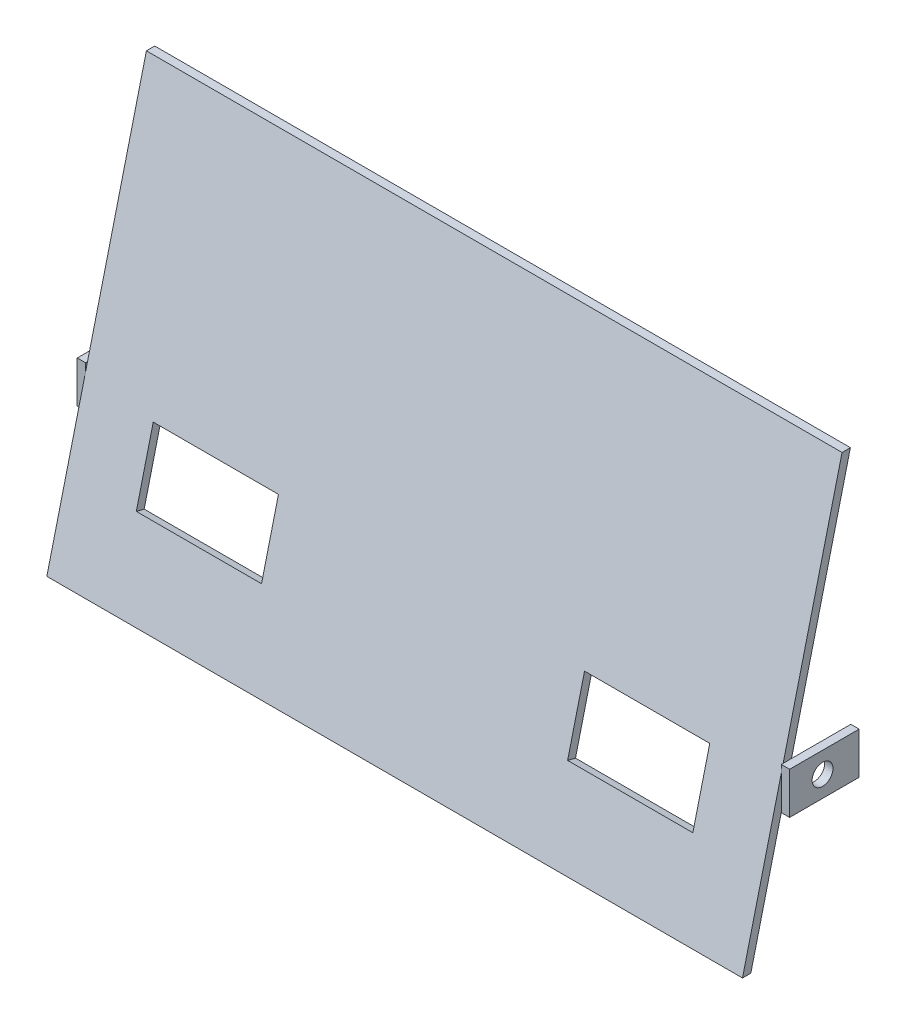
ISO-10303-21;
HEADER;
FILE_DESCRIPTION(('STEP AP214'),'2;1');
FILE_NAME('part.step','',(''),(''),'','','');
FILE_SCHEMA(('AUTOMOTIVE_DESIGN { 1 0 10303 214 1 1 1 1 }'));
ENDSEC;
DATA;
#1=APPLICATION_CONTEXT('core data for automotive mechanical design processes');
#2=APPLICATION_PROTOCOL_DEFINITION('international standard','automotive_design',2000,#1);
#3=PRODUCT_CONTEXT('',#1,'mechanical');
#4=PRODUCT('Part','Part','',(#3));
#5=PRODUCT_RELATED_PRODUCT_CATEGORY('part','',(#4));
#6=PRODUCT_DEFINITION_FORMATION('','',#4);
#7=PRODUCT_DEFINITION_CONTEXT('part definition',#1,'design');
#8=PRODUCT_DEFINITION('design','',#6,#7);
#9=PRODUCT_DEFINITION_SHAPE('','',#8);
#10=(LENGTH_UNIT() NAMED_UNIT(*) SI_UNIT(.MILLI.,.METRE.));
#11=(NAMED_UNIT(*) PLANE_ANGLE_UNIT() SI_UNIT($,.RADIAN.));
#12=(NAMED_UNIT(*) SI_UNIT($,.STERADIAN.) SOLID_ANGLE_UNIT());
#13=UNCERTAINTY_MEASURE_WITH_UNIT(LENGTH_MEASURE(1.E-05),#10,'distance_accuracy_value','');
#14=(GEOMETRIC_REPRESENTATION_CONTEXT(3) GLOBAL_UNCERTAINTY_ASSIGNED_CONTEXT((#13)) GLOBAL_UNIT_ASSIGNED_CONTEXT((#10,
#11,#12)) REPRESENTATION_CONTEXT('',''));
#15=CARTESIAN_POINT('',(0.,0.,0.));
#16=DIRECTION('',(0.,0.,1.));
#17=DIRECTION('',(1.,0.,0.));
#18=AXIS2_PLACEMENT_3D('',#15,#16,#17);
#19=CARTESIAN_POINT('',(-100.,0.,0.));
#20=DIRECTION('',(-1.,0.,0.));
#21=DIRECTION('',(0.,0.,1.));
#22=AXIS2_PLACEMENT_3D('',#19,#20,#21);
#23=PLANE('',#22);
#24=DIRECTION('',(0.,0.,-1.));
#25=VECTOR('',#24,1.);
#26=CARTESIAN_POINT('',(-100.,23.8,-15.5720993406739));
#27=LINE('',#26,#25);
#28=CARTESIAN_POINT('',(-100.,23.8,-5.84584069146286));
#29=VERTEX_POINT('',#28);
#30=CARTESIAN_POINT('',(-100.,23.8,-7.04584069146286));
#31=VERTEX_POINT('',#30);
#32=EDGE_CURVE('E307',#29,#31,#27,.T.);
#33=ORIENTED_EDGE('',*,*,#32,.F.);
#34=DIRECTION('',(0.,-0.971134279909636,0.238533457578581));
#35=VECTOR('',#34,1.);
#36=CARTESIAN_POINT('',(-100.,0.,0.));
#37=LINE('',#36,#35);
#38=CARTESIAN_POINT('',(-100.,58.2680567945782,-14.3120074547149));
#39=VERTEX_POINT('',#38);
#40=EDGE_CURVE('E370',#39,#29,#37,.T.);
#41=ORIENTED_EDGE('',*,*,#40,.F.);
#42=DIRECTION('',(0.,0.,1.));
#43=VECTOR('',#42,1.);
#44=CARTESIAN_POINT('',(-100.,58.2680567945782,-14.3120074547149));
#45=LINE('',#44,#43);
#46=CARTESIAN_POINT('',(-100.,58.2680567945782,-15.5120074547149));
#47=VERTEX_POINT('',#46);
#48=EDGE_CURVE('E385',#47,#39,#45,.T.);
#49=ORIENTED_EDGE('',*,*,#48,.F.);
#50=DIRECTION('',(0.,0.971134279909636,-0.238533457578581));
#51=VECTOR('',#50,1.);
#52=CARTESIAN_POINT('',(-100.,0.,-1.2));
#53=LINE('',#52,#51);
#54=EDGE_CURVE('E380',#31,#47,#53,.T.);
#55=ORIENTED_EDGE('',*,*,#54,.F.);
#56=EDGE_LOOP('',(#33,#41,#49,#55));
#57=FACE_BOUND('',#56,.T.);
#58=ADVANCED_FACE('F39',(#57),#23,.T.);
#59=CARTESIAN_POINT('',(0.,0.,0.));
#60=DIRECTION('',(-1.,0.,0.));
#61=DIRECTION('',(0.,0.,1.));
#62=AXIS2_PLACEMENT_3D('',#59,#60,#61);
#63=PLANE('',#62);
#64=DIRECTION('',(0.,-1.,0.));
#65=VECTOR('',#64,1.);
#66=CARTESIAN_POINT('',(0.,17.8,-5.57209934067391));
#67=LINE('',#66,#65);
#68=CARTESIAN_POINT('',(0.,22.6855248555966,-5.57209934067391));
#69=VERTEX_POINT('',#68);
#70=CARTESIAN_POINT('',(0.,17.8,-5.57209934067391));
#71=VERTEX_POINT('',#70);
#72=EDGE_CURVE('E343',#69,#71,#67,.T.);
#73=ORIENTED_EDGE('',*,*,#72,.F.);
#74=DIRECTION('',(0.,-0.971134279909636,0.238533457578581));
#75=VECTOR('',#74,1.);
#76=CARTESIAN_POINT('',(0.,0.,0.));
#77=LINE('',#76,#75);
#78=CARTESIAN_POINT('',(0.,0.,0.));
#79=VERTEX_POINT('',#78);
#80=EDGE_CURVE('E369',#69,#79,#77,.T.);
#81=ORIENTED_EDGE('',*,*,#80,.T.);
#82=DIRECTION('',(0.,0.,-1.));
#83=VECTOR('',#82,1.);
#84=CARTESIAN_POINT('',(0.,0.,0.));
#85=LINE('',#84,#83);
#86=CARTESIAN_POINT('',(0.,0.,-1.2));
#87=VERTEX_POINT('',#86);
#88=EDGE_CURVE('E394',#79,#87,#85,.T.);
#89=ORIENTED_EDGE('',*,*,#88,.T.);
#90=DIRECTION('',(0.,0.971134279909636,-0.238533457578581));
#91=VECTOR('',#90,1.);
#92=CARTESIAN_POINT('',(0.,0.,-1.2));
#93=LINE('',#92,#91);
#94=EDGE_CURVE('E400',#87,#71,#93,.T.);
#95=ORIENTED_EDGE('',*,*,#94,.T.);
#96=EDGE_LOOP('',(#73,#81,#89,#95));
#97=FACE_BOUND('',#96,.T.);
#98=ADVANCED_FACE('F464',(#97),#63,.F.);
#99=DIRECTION('',(0.,0.,1.));
#100=VECTOR('',#99,1.);
#101=CARTESIAN_POINT('',(0.,23.8,-5.57209934067391));
#102=LINE('',#101,#100);
#103=CARTESIAN_POINT('',(0.,23.8,-7.04584069146286));
#104=VERTEX_POINT('',#103);
#105=CARTESIAN_POINT('',(0.,23.8,-5.84584069146286));
#106=VERTEX_POINT('',#105);
#107=EDGE_CURVE('E353',#104,#106,#102,.T.);
#108=ORIENTED_EDGE('',*,*,#107,.F.);
#109=CARTESIAN_POINT('',(0.,58.2680567945782,-15.5120074547149));
#110=VERTEX_POINT('',#109);
#111=EDGE_CURVE('E399',#104,#110,#93,.T.);
#112=ORIENTED_EDGE('',*,*,#111,.T.);
#113=DIRECTION('',(0.,0.,1.));
#114=VECTOR('',#113,1.);
#115=CARTESIAN_POINT('',(0.,58.2680567945782,-14.3120074547149));
#116=LINE('',#115,#114);
#117=CARTESIAN_POINT('',(0.,58.2680567945782,-14.3120074547149));
#118=VERTEX_POINT('',#117);
#119=EDGE_CURVE('E404',#110,#118,#116,.T.);
#120=ORIENTED_EDGE('',*,*,#119,.T.);
#121=EDGE_CURVE('E391',#118,#106,#77,.T.);
#122=ORIENTED_EDGE('',*,*,#121,.T.);
#123=EDGE_LOOP('',(#108,#112,#120,#122));
#124=FACE_BOUND('',#123,.T.);
#125=ADVANCED_FACE('F473',(#124),#63,.F.);
#126=CARTESIAN_POINT('',(-100.,0.,0.));
#127=DIRECTION('',(0.,0.238533457578581,0.971134279909636));
#128=DIRECTION('',(0.,-0.971134279909636,0.238533457578581));
#129=AXIS2_PLACEMENT_3D('',#126,#127,#128);
#130=PLANE('',#129);
#131=DIRECTION('',(0.,-0.971134279909636,0.238533457578581));
#132=VECTOR('',#131,1.);
#133=CARTESIAN_POINT('',(-90.,21.5591810139939,-5.29544275824451));
#134=LINE('',#133,#132);
#135=CARTESIAN_POINT('',(-90.,21.5591810139939,-5.29544275824451));
#136=VERTEX_POINT('',#135);
#137=CARTESIAN_POINT('',(-90.,11.6536113589156,-2.86240149094298));
#138=VERTEX_POINT('',#137);
#139=EDGE_CURVE('E55',#136,#138,#134,.T.);
#140=ORIENTED_EDGE('',*,*,#139,.F.);
#141=DIRECTION('',(-1.,0.,0.));
#142=VECTOR('',#141,1.);
#143=CARTESIAN_POINT('',(-90.,21.5591810139939,-5.29544275824451));
#144=LINE('',#143,#142);
#145=CARTESIAN_POINT('',(-72.,21.5591810139939,-5.29544275824451));
#146=VERTEX_POINT('',#145);
#147=EDGE_CURVE('E219',#146,#136,#144,.T.);
#148=ORIENTED_EDGE('',*,*,#147,.F.);
#149=DIRECTION('',(0.,0.971134279909636,-0.238533457578582));
#150=VECTOR('',#149,1.);
#151=CARTESIAN_POINT('',(-72.,21.5591810139939,-5.29544275824451));
#152=LINE('',#151,#150);
#153=CARTESIAN_POINT('',(-72.,11.6536113589156,-2.86240149094298));
#154=VERTEX_POINT('',#153);
#155=EDGE_CURVE('E201',#154,#146,#152,.T.);
#156=ORIENTED_EDGE('',*,*,#155,.F.);
#157=DIRECTION('',(1.,0.,0.));
#158=VECTOR('',#157,1.);
#159=CARTESIAN_POINT('',(-90.,11.6536113589156,-2.86240149094298));
#160=LINE('',#159,#158);
#161=EDGE_CURVE('E212',#138,#154,#160,.T.);
#162=ORIENTED_EDGE('',*,*,#161,.F.);
#163=EDGE_LOOP('',(#140,#148,#156,#162));
#164=FACE_BOUND('',#163,.T.);
#165=DIRECTION('',(0.,0.971134279909636,-0.238533457578581));
#166=VECTOR('',#165,1.);
#167=CARTESIAN_POINT('',(-9.99999999999999,21.5591810139939,-5.29544275824451));
#168=LINE('',#167,#166);
#169=CARTESIAN_POINT('',(-9.99999999999999,11.6536113589156,-2.86240149094298));
#170=VERTEX_POINT('',#169);
#171=CARTESIAN_POINT('',(-9.99999999999999,21.5591810139939,-5.29544275824451));
#172=VERTEX_POINT('',#171);
#173=EDGE_CURVE('E63',#170,#172,#168,.T.);
#174=ORIENTED_EDGE('',*,*,#173,.F.);
#175=DIRECTION('',(1.,0.,0.));
#176=VECTOR('',#175,1.);
#177=CARTESIAN_POINT('',(-9.99999999999999,11.6536113589156,-2.86240149094298));
#178=LINE('',#177,#176);
#179=CARTESIAN_POINT('',(-28.,11.6536113589156,-2.86240149094298));
#180=VERTEX_POINT('',#179);
#181=EDGE_CURVE('E244',#180,#170,#178,.T.);
#182=ORIENTED_EDGE('',*,*,#181,.F.);
#183=DIRECTION('',(0.,-0.971134279909636,0.238533457578582));
#184=VECTOR('',#183,1.);
#185=CARTESIAN_POINT('',(-28.,21.5591810139939,-5.29544275824451));
#186=LINE('',#185,#184);
#187=CARTESIAN_POINT('',(-28.,21.5591810139939,-5.29544275824451));
#188=VERTEX_POINT('',#187);
#189=EDGE_CURVE('E240',#188,#180,#186,.T.);
#190=ORIENTED_EDGE('',*,*,#189,.F.);
#191=DIRECTION('',(-1.,0.,0.));
#192=VECTOR('',#191,1.);
#193=CARTESIAN_POINT('',(-9.99999999999999,21.5591810139939,-5.29544275824451));
#194=LINE('',#193,#192);
#195=EDGE_CURVE('E236',#172,#188,#194,.T.);
#196=ORIENTED_EDGE('',*,*,#195,.F.);
#197=EDGE_LOOP('',(#174,#182,#190,#196));
#198=FACE_BOUND('',#197,.T.);
#199=ORIENTED_EDGE('',*,*,#121,.F.);
#200=DIRECTION('',(1.,0.,0.));
#201=VECTOR('',#200,1.);
#202=CARTESIAN_POINT('',(-100.,58.2680567945782,-14.3120074547149));
#203=LINE('',#202,#201);
#204=EDGE_CURVE('E409',#39,#118,#203,.T.);
#205=ORIENTED_EDGE('',*,*,#204,.F.);
#206=ORIENTED_EDGE('',*,*,#40,.T.);
#207=CARTESIAN_POINT('',(-100.,22.6855248555966,-5.57209934067391));
#208=VERTEX_POINT('',#207);
#209=EDGE_CURVE('E375',#29,#208,#37,.T.);
#210=ORIENTED_EDGE('',*,*,#209,.T.);
#211=CARTESIAN_POINT('',(-100.,0.,0.));
#212=VERTEX_POINT('',#211);
#213=EDGE_CURVE('E376',#208,#212,#37,.T.);
#214=ORIENTED_EDGE('',*,*,#213,.T.);
#215=DIRECTION('',(1.,0.,0.));
#216=VECTOR('',#215,1.);
#217=CARTESIAN_POINT('',(-100.,0.,0.));
#218=LINE('',#217,#216);
#219=EDGE_CURVE('E390',#212,#79,#218,.T.);
#220=ORIENTED_EDGE('',*,*,#219,.T.);
#221=ORIENTED_EDGE('',*,*,#80,.F.);
#222=EDGE_CURVE('E395',#106,#69,#77,.T.);
#223=ORIENTED_EDGE('',*,*,#222,.F.);
#224=EDGE_LOOP('',(#199,#205,#206,#210,#214,#220,#221,#223));
#225=FACE_BOUND('',#224,.T.);
#226=ADVANCED_FACE('F41',(#164,#198,#225),#130,.T.);
#227=CARTESIAN_POINT('',(-100.,58.2680567945782,-14.3120074547149));
#228=DIRECTION('',(0.,1.,0.));
#229=DIRECTION('',(0.,0.,1.));
#230=AXIS2_PLACEMENT_3D('',#227,#228,#229);
#231=PLANE('',#230);
#232=ORIENTED_EDGE('',*,*,#119,.F.);
#233=DIRECTION('',(1.,0.,0.));
#234=VECTOR('',#233,1.);
#235=CARTESIAN_POINT('',(-100.,58.2680567945782,-15.5120074547149));
#236=LINE('',#235,#234);
#237=EDGE_CURVE('E412',#47,#110,#236,.T.);
#238=ORIENTED_EDGE('',*,*,#237,.F.);
#239=ORIENTED_EDGE('',*,*,#48,.T.);
#240=ORIENTED_EDGE('',*,*,#204,.T.);
#241=EDGE_LOOP('',(#232,#238,#239,#240));
#242=FACE_BOUND('',#241,.T.);
#243=ADVANCED_FACE('F558',(#242),#231,.T.);
#244=CARTESIAN_POINT('',(-100.,0.,-1.2));
#245=DIRECTION('',(0.,-0.238533457578581,-0.971134279909636));
#246=DIRECTION('',(0.,0.971134279909636,-0.238533457578581));
#247=AXIS2_PLACEMENT_3D('',#244,#245,#246);
#248=PLANE('',#247);
#249=DIRECTION('',(0.,0.971134279909636,-0.238533457578581));
#250=VECTOR('',#249,1.);
#251=CARTESIAN_POINT('',(-90.,0.,-1.2));
#252=LINE('',#251,#250);
#253=CARTESIAN_POINT('',(-90.,11.3756337378437,-3.9941236384817));
#254=VERTEX_POINT('',#253);
#255=CARTESIAN_POINT('',(-90.,21.281203392922,-6.42716490578323));
#256=VERTEX_POINT('',#255);
#257=EDGE_CURVE('E11',#254,#256,#252,.T.);
#258=ORIENTED_EDGE('',*,*,#257,.F.);
#259=DIRECTION('',(-1.,0.,0.));
#260=VECTOR('',#259,1.);
#261=CARTESIAN_POINT('',(-100.,11.3756337378437,-3.99412363848171));
#262=LINE('',#261,#260);
#263=CARTESIAN_POINT('',(-72.,11.3756337378437,-3.99412363848171));
#264=VERTEX_POINT('',#263);
#265=EDGE_CURVE('E435',#264,#254,#262,.T.);
#266=ORIENTED_EDGE('',*,*,#265,.F.);
#267=DIRECTION('',(0.,-0.971134279909636,0.238533457578581));
#268=VECTOR('',#267,1.);
#269=CARTESIAN_POINT('',(-72.,0.,-1.2));
#270=LINE('',#269,#268);
#271=CARTESIAN_POINT('',(-72.,21.281203392922,-6.42716490578324));
#272=VERTEX_POINT('',#271);
#273=EDGE_CURVE('E204',#272,#264,#270,.T.);
#274=ORIENTED_EDGE('',*,*,#273,.F.);
#275=DIRECTION('',(1.,0.,0.));
#276=VECTOR('',#275,1.);
#277=CARTESIAN_POINT('',(-100.,21.281203392922,-6.42716490578324));
#278=LINE('',#277,#276);
#279=EDGE_CURVE('E48',#256,#272,#278,.T.);
#280=ORIENTED_EDGE('',*,*,#279,.F.);
#281=EDGE_LOOP('',(#258,#266,#274,#280));
#282=FACE_BOUND('',#281,.T.);
#283=DIRECTION('',(0.,-0.971134279909636,0.238533457578581));
#284=VECTOR('',#283,1.);
#285=CARTESIAN_POINT('',(-9.99999999999999,0.,-1.2));
#286=LINE('',#285,#284);
#287=CARTESIAN_POINT('',(-9.99999999999999,21.281203392922,-6.42716490578323));
#288=VERTEX_POINT('',#287);
#289=CARTESIAN_POINT('',(-9.99999999999999,11.3756337378437,-3.9941236384817));
#290=VERTEX_POINT('',#289);
#291=EDGE_CURVE('E432',#288,#290,#286,.T.);
#292=ORIENTED_EDGE('',*,*,#291,.F.);
#293=DIRECTION('',(1.,0.,0.));
#294=VECTOR('',#293,1.);
#295=CARTESIAN_POINT('',(-100.,21.281203392922,-6.42716490578323));
#296=LINE('',#295,#294);
#297=CARTESIAN_POINT('',(-28.,21.281203392922,-6.42716490578323));
#298=VERTEX_POINT('',#297);
#299=EDGE_CURVE('E422',#298,#288,#296,.T.);
#300=ORIENTED_EDGE('',*,*,#299,.F.);
#301=DIRECTION('',(0.,0.971134279909636,-0.238533457578581));
#302=VECTOR('',#301,1.);
#303=CARTESIAN_POINT('',(-28.,0.,-1.2));
#304=LINE('',#303,#302);
#305=CARTESIAN_POINT('',(-28.,11.3756337378437,-3.99412363848171));
#306=VERTEX_POINT('',#305);
#307=EDGE_CURVE('E425',#306,#298,#304,.T.);
#308=ORIENTED_EDGE('',*,*,#307,.F.);
#309=DIRECTION('',(-1.,0.,0.));
#310=VECTOR('',#309,1.);
#311=CARTESIAN_POINT('',(-100.,11.3756337378437,-3.99412363848171));
#312=LINE('',#311,#310);
#313=EDGE_CURVE('E429',#290,#306,#312,.T.);
#314=ORIENTED_EDGE('',*,*,#313,.F.);
#315=EDGE_LOOP('',(#292,#300,#308,#314));
#316=FACE_BOUND('',#315,.T.);
#317=ORIENTED_EDGE('',*,*,#94,.F.);
#318=DIRECTION('',(1.,0.,0.));
#319=VECTOR('',#318,1.);
#320=CARTESIAN_POINT('',(-100.,0.,-1.2));
#321=LINE('',#320,#319);
#322=CARTESIAN_POINT('',(-100.,0.,-1.2));
#323=VERTEX_POINT('',#322);
#324=EDGE_CURVE('E416',#323,#87,#321,.T.);
#325=ORIENTED_EDGE('',*,*,#324,.F.);
#326=CARTESIAN_POINT('',(-100.,17.8,-5.57209934067391));
#327=VERTEX_POINT('',#326);
#328=EDGE_CURVE('E381',#323,#327,#53,.T.);
#329=ORIENTED_EDGE('',*,*,#328,.T.);
#330=EDGE_CURVE('E386',#327,#31,#53,.T.);
#331=ORIENTED_EDGE('',*,*,#330,.T.);
#332=ORIENTED_EDGE('',*,*,#54,.T.);
#333=ORIENTED_EDGE('',*,*,#237,.T.);
#334=ORIENTED_EDGE('',*,*,#111,.F.);
#335=EDGE_CURVE('E405',#71,#104,#93,.T.);
#336=ORIENTED_EDGE('',*,*,#335,.F.);
#337=EDGE_LOOP('',(#317,#325,#329,#331,#332,#333,#334,#336));
#338=FACE_BOUND('',#337,.T.);
#339=ADVANCED_FACE('F446',(#282,#316,#338),#248,.T.);
#340=CARTESIAN_POINT('',(-100.,0.,0.));
#341=DIRECTION('',(0.,-1.,0.));
#342=DIRECTION('',(0.,0.,-1.));
#343=AXIS2_PLACEMENT_3D('',#340,#341,#342);
#344=PLANE('',#343);
#345=ORIENTED_EDGE('',*,*,#88,.F.);
#346=ORIENTED_EDGE('',*,*,#219,.F.);
#347=DIRECTION('',(0.,0.,-1.));
#348=VECTOR('',#347,1.);
#349=CARTESIAN_POINT('',(-100.,0.,0.));
#350=LINE('',#349,#348);
#351=EDGE_CURVE('E374',#212,#323,#350,.T.);
#352=ORIENTED_EDGE('',*,*,#351,.T.);
#353=ORIENTED_EDGE('',*,*,#324,.T.);
#354=EDGE_LOOP('',(#345,#346,#352,#353));
#355=FACE_BOUND('',#354,.T.);
#356=ADVANCED_FACE('F478',(#355),#344,.T.);
#357=DIRECTION('',(0.,1.,0.));
#358=VECTOR('',#357,1.);
#359=CARTESIAN_POINT('',(-100.,17.8,-5.57209934067391));
#360=LINE('',#359,#358);
#361=EDGE_CURVE('E299',#327,#208,#360,.T.);
#362=ORIENTED_EDGE('',*,*,#361,.F.);
#363=ORIENTED_EDGE('',*,*,#328,.F.);
#364=ORIENTED_EDGE('',*,*,#351,.F.);
#365=ORIENTED_EDGE('',*,*,#213,.F.);
#366=EDGE_LOOP('',(#362,#363,#364,#365));
#367=FACE_BOUND('',#366,.T.);
#368=ADVANCED_FACE('F467',(#367),#23,.T.);
#369=CARTESIAN_POINT('',(0.,0.,0.));
#370=DIRECTION('',(-1.,0.,0.));
#371=DIRECTION('',(0.,0.,1.));
#372=AXIS2_PLACEMENT_3D('',#369,#370,#371);
#373=PLANE('',#372);
#374=CARTESIAN_POINT('',(0.,23.8,-5.57209934067391));
#375=VERTEX_POINT('',#374);
#376=EDGE_CURVE('E349',#106,#375,#102,.T.);
#377=ORIENTED_EDGE('',*,*,#376,.F.);
#378=ORIENTED_EDGE('',*,*,#222,.T.);
#379=EDGE_CURVE('E323',#375,#69,#67,.T.);
#380=ORIENTED_EDGE('',*,*,#379,.F.);
#381=EDGE_LOOP('',(#377,#378,#380));
#382=FACE_BOUND('',#381,.T.);
#383=ADVANCED_FACE('F477',(#382),#373,.T.);
#384=CARTESIAN_POINT('',(1.2,17.8,-5.57209934067391));
#385=DIRECTION('',(0.,0.,-1.));
#386=DIRECTION('',(-1.,0.,0.));
#387=AXIS2_PLACEMENT_3D('',#384,#385,#386);
#388=PLANE('',#387);
#389=ORIENTED_EDGE('',*,*,#379,.T.);
#390=ORIENTED_EDGE('',*,*,#72,.T.);
#391=DIRECTION('',(-1.,0.,0.));
#392=VECTOR('',#391,1.);
#393=CARTESIAN_POINT('',(1.2,17.8,-5.57209934067391));
#394=LINE('',#393,#392);
#395=CARTESIAN_POINT('',(1.2,17.8,-5.57209934067391));
#396=VERTEX_POINT('',#395);
#397=EDGE_CURVE('E365',#396,#71,#394,.T.);
#398=ORIENTED_EDGE('',*,*,#397,.F.);
#399=DIRECTION('',(0.,-1.,0.));
#400=VECTOR('',#399,1.);
#401=CARTESIAN_POINT('',(1.2,17.8,-5.57209934067391));
#402=LINE('',#401,#400);
#403=CARTESIAN_POINT('',(1.2,23.8,-5.57209934067391));
#404=VERTEX_POINT('',#403);
#405=EDGE_CURVE('E324',#404,#396,#402,.T.);
#406=ORIENTED_EDGE('',*,*,#405,.F.);
#407=DIRECTION('',(-1.,0.,0.));
#408=VECTOR('',#407,1.);
#409=CARTESIAN_POINT('',(1.2,23.8,-5.57209934067391));
#410=LINE('',#409,#408);
#411=EDGE_CURVE('E338',#404,#375,#410,.T.);
#412=ORIENTED_EDGE('',*,*,#411,.T.);
#413=EDGE_LOOP('',(#389,#390,#398,#406,#412));
#414=FACE_BOUND('',#413,.T.);
#415=ADVANCED_FACE('F484',(#414),#388,.F.);
#416=CARTESIAN_POINT('',(1.2,17.8,-5.57209934067391));
#417=DIRECTION('',(0.,1.,0.));
#418=DIRECTION('',(0.,0.,1.));
#419=AXIS2_PLACEMENT_3D('',#416,#417,#418);
#420=PLANE('',#419);
#421=DIRECTION('',(0.,0.,-1.));
#422=VECTOR('',#421,1.);
#423=CARTESIAN_POINT('',(0.,17.8,-5.57209934067391));
#424=LINE('',#423,#422);
#425=CARTESIAN_POINT('',(0.,17.8,-15.5720993406739));
#426=VERTEX_POINT('',#425);
#427=EDGE_CURVE('E342',#71,#426,#424,.T.);
#428=ORIENTED_EDGE('',*,*,#427,.T.);
#429=DIRECTION('',(-1.,0.,0.));
#430=VECTOR('',#429,1.);
#431=CARTESIAN_POINT('',(1.2,17.8,-15.5720993406739));
#432=LINE('',#431,#430);
#433=CARTESIAN_POINT('',(1.2,17.8,-15.5720993406739));
#434=VERTEX_POINT('',#433);
#435=EDGE_CURVE('E361',#434,#426,#432,.T.);
#436=ORIENTED_EDGE('',*,*,#435,.F.);
#437=DIRECTION('',(0.,0.,-1.));
#438=VECTOR('',#437,1.);
#439=CARTESIAN_POINT('',(1.2,17.8,-5.57209934067391));
#440=LINE('',#439,#438);
#441=EDGE_CURVE('E328',#396,#434,#440,.T.);
#442=ORIENTED_EDGE('',*,*,#441,.F.);
#443=ORIENTED_EDGE('',*,*,#397,.T.);
#444=EDGE_LOOP('',(#428,#436,#442,#443));
#445=FACE_BOUND('',#444,.T.);
#446=ADVANCED_FACE('F595',(#445),#420,.F.);
#447=CARTESIAN_POINT('',(1.2,17.8,-15.5720993406739));
#448=DIRECTION('',(0.,0.,1.));
#449=DIRECTION('',(0.,-1.,0.));
#450=AXIS2_PLACEMENT_3D('',#447,#448,#449);
#451=PLANE('',#450);
#452=DIRECTION('',(0.,1.,0.));
#453=VECTOR('',#452,1.);
#454=CARTESIAN_POINT('',(0.,17.8,-15.5720993406739));
#455=LINE('',#454,#453);
#456=CARTESIAN_POINT('',(0.,23.8,-15.5720993406739));
#457=VERTEX_POINT('',#456);
#458=EDGE_CURVE('E346',#426,#457,#455,.T.);
#459=ORIENTED_EDGE('',*,*,#458,.T.);
#460=DIRECTION('',(-1.,0.,0.));
#461=VECTOR('',#460,1.);
#462=CARTESIAN_POINT('',(1.2,23.8,-15.5720993406739));
#463=LINE('',#462,#461);
#464=CARTESIAN_POINT('',(1.2,23.8,-15.5720993406739));
#465=VERTEX_POINT('',#464);
#466=EDGE_CURVE('E357',#465,#457,#463,.T.);
#467=ORIENTED_EDGE('',*,*,#466,.F.);
#468=DIRECTION('',(0.,1.,0.));
#469=VECTOR('',#468,1.);
#470=CARTESIAN_POINT('',(1.2,17.8,-15.5720993406739));
#471=LINE('',#470,#469);
#472=EDGE_CURVE('E332',#434,#465,#471,.T.);
#473=ORIENTED_EDGE('',*,*,#472,.F.);
#474=ORIENTED_EDGE('',*,*,#435,.T.);
#475=EDGE_LOOP('',(#459,#467,#473,#474));
#476=FACE_BOUND('',#475,.T.);
#477=ADVANCED_FACE('F592',(#476),#451,.F.);
#478=CARTESIAN_POINT('',(1.2,23.8,-5.57209934067391));
#479=DIRECTION('',(0.,-1.,0.));
#480=DIRECTION('',(0.,0.,-1.));
#481=AXIS2_PLACEMENT_3D('',#478,#479,#480);
#482=PLANE('',#481);
#483=EDGE_CURVE('E329',#457,#104,#102,.T.);
#484=ORIENTED_EDGE('',*,*,#483,.T.);
#485=ORIENTED_EDGE('',*,*,#107,.T.);
#486=ORIENTED_EDGE('',*,*,#376,.T.);
#487=ORIENTED_EDGE('',*,*,#411,.F.);
#488=DIRECTION('',(0.,0.,1.));
#489=VECTOR('',#488,1.);
#490=CARTESIAN_POINT('',(1.2,23.8,-5.57209934067391));
#491=LINE('',#490,#489);
#492=EDGE_CURVE('E335',#465,#404,#491,.T.);
#493=ORIENTED_EDGE('',*,*,#492,.F.);
#494=ORIENTED_EDGE('',*,*,#466,.T.);
#495=EDGE_LOOP('',(#484,#485,#486,#487,#493,#494));
#496=FACE_BOUND('',#495,.T.);
#497=ADVANCED_FACE('F534',(#496),#482,.F.);
#498=CARTESIAN_POINT('',(1.2,0.,0.));
#499=DIRECTION('',(-1.,0.,0.));
#500=DIRECTION('',(0.,0.,1.));
#501=AXIS2_PLACEMENT_3D('',#498,#499,#500);
#502=PLANE('',#501);
#503=CARTESIAN_POINT('',(1.2,20.8,-10.3089700160684));
#504=DIRECTION('',(1.,0.,0.));
#505=DIRECTION('',(0.,0.,-1.));
#506=AXIS2_PLACEMENT_3D('',#503,#504,#505);
#507=CIRCLE('',#506,1.5);
#508=CARTESIAN_POINT('',(1.2,20.8,-11.8089700160684));
#509=VERTEX_POINT('',#508);
#510=EDGE_CURVE('E229',#509,#509,#507,.T.);
#511=ORIENTED_EDGE('',*,*,#510,.F.);
#512=EDGE_LOOP('',(#511));
#513=FACE_BOUND('',#512,.T.);
#514=ORIENTED_EDGE('',*,*,#405,.T.);
#515=ORIENTED_EDGE('',*,*,#441,.T.);
#516=ORIENTED_EDGE('',*,*,#472,.T.);
#517=ORIENTED_EDGE('',*,*,#492,.T.);
#518=EDGE_LOOP('',(#514,#515,#516,#517));
#519=FACE_BOUND('',#518,.T.);
#520=ADVANCED_FACE('F574',(#513,#519),#502,.F.);
#521=CARTESIAN_POINT('',(0.,20.8,-10.3089700160684));
#522=DIRECTION('',(-1.,0.,0.));
#523=DIRECTION('',(0.,0.,1.));
#524=AXIS2_PLACEMENT_3D('',#521,#522,#523);
#525=CIRCLE('',#524,1.5);
#526=CARTESIAN_POINT('',(0.,20.8,-8.80897001606839));
#527=VERTEX_POINT('',#526);
#528=EDGE_CURVE('E271',#527,#527,#525,.T.);
#529=ORIENTED_EDGE('',*,*,#528,.F.);
#530=EDGE_LOOP('',(#529));
#531=FACE_BOUND('',#530,.T.);
#532=ORIENTED_EDGE('',*,*,#427,.F.);
#533=ORIENTED_EDGE('',*,*,#335,.T.);
#534=ORIENTED_EDGE('',*,*,#483,.F.);
#535=ORIENTED_EDGE('',*,*,#458,.F.);
#536=EDGE_LOOP('',(#532,#533,#534,#535));
#537=FACE_BOUND('',#536,.T.);
#538=ADVANCED_FACE('F487',(#531,#537),#373,.T.);
#539=CARTESIAN_POINT('',(-100.,0.,0.));
#540=DIRECTION('',(1.,0.,0.));
#541=DIRECTION('',(0.,0.,-1.));
#542=AXIS2_PLACEMENT_3D('',#539,#540,#541);
#543=PLANE('',#542);
#544=ORIENTED_EDGE('',*,*,#209,.F.);
#545=CARTESIAN_POINT('',(-100.,23.8,-5.57209934067391));
#546=VERTEX_POINT('',#545);
#547=EDGE_CURVE('E281',#546,#29,#27,.T.);
#548=ORIENTED_EDGE('',*,*,#547,.F.);
#549=EDGE_CURVE('E298',#208,#546,#360,.T.);
#550=ORIENTED_EDGE('',*,*,#549,.F.);
#551=EDGE_LOOP('',(#544,#548,#550));
#552=FACE_BOUND('',#551,.T.);
#553=ADVANCED_FACE('F566',(#552),#543,.T.);
#554=CARTESIAN_POINT('',(-100.,20.8,-10.3089700160684));
#555=DIRECTION('',(1.,0.,0.));
#556=DIRECTION('',(0.,0.,-1.));
#557=AXIS2_PLACEMENT_3D('',#554,#555,#556);
#558=CIRCLE('',#557,1.5);
#559=CARTESIAN_POINT('',(-100.,20.8,-11.8089700160684));
#560=VERTEX_POINT('',#559);
#561=EDGE_CURVE('E264',#560,#560,#558,.T.);
#562=ORIENTED_EDGE('',*,*,#561,.F.);
#563=EDGE_LOOP('',(#562));
#564=FACE_BOUND('',#563,.T.);
#565=ORIENTED_EDGE('',*,*,#330,.F.);
#566=DIRECTION('',(0.,0.,1.));
#567=VECTOR('',#566,1.);
#568=CARTESIAN_POINT('',(-100.,17.8,-15.5720993406739));
#569=LINE('',#568,#567);
#570=CARTESIAN_POINT('',(-100.,17.8,-15.5720993406739));
#571=VERTEX_POINT('',#570);
#572=EDGE_CURVE('E294',#571,#327,#569,.T.);
#573=ORIENTED_EDGE('',*,*,#572,.F.);
#574=DIRECTION('',(0.,-1.,0.));
#575=VECTOR('',#574,1.);
#576=CARTESIAN_POINT('',(-100.,17.8,-15.5720993406739));
#577=LINE('',#576,#575);
#578=CARTESIAN_POINT('',(-100.,23.8,-15.5720993406739));
#579=VERTEX_POINT('',#578);
#580=EDGE_CURVE('E275',#579,#571,#577,.T.);
#581=ORIENTED_EDGE('',*,*,#580,.F.);
#582=EDGE_CURVE('E303',#31,#579,#27,.T.);
#583=ORIENTED_EDGE('',*,*,#582,.F.);
#584=EDGE_LOOP('',(#565,#573,#581,#583));
#585=FACE_BOUND('',#584,.T.);
#586=ADVANCED_FACE('F501',(#564,#585),#543,.T.);
#587=CARTESIAN_POINT('',(-101.2,17.8,-15.5720993406739));
#588=DIRECTION('',(0.,0.,1.));
#589=DIRECTION('',(1.,0.,0.));
#590=AXIS2_PLACEMENT_3D('',#587,#588,#589);
#591=PLANE('',#590);
#592=ORIENTED_EDGE('',*,*,#580,.T.);
#593=DIRECTION('',(1.,0.,0.));
#594=VECTOR('',#593,1.);
#595=CARTESIAN_POINT('',(-101.2,17.8,-15.5720993406739));
#596=LINE('',#595,#594);
#597=CARTESIAN_POINT('',(-101.2,17.8,-15.5720993406739));
#598=VERTEX_POINT('',#597);
#599=EDGE_CURVE('E319',#598,#571,#596,.T.);
#600=ORIENTED_EDGE('',*,*,#599,.F.);
#601=DIRECTION('',(0.,-1.,0.));
#602=VECTOR('',#601,1.);
#603=CARTESIAN_POINT('',(-101.2,17.8,-15.5720993406739));
#604=LINE('',#603,#602);
#605=CARTESIAN_POINT('',(-101.2,23.8,-15.5720993406739));
#606=VERTEX_POINT('',#605);
#607=EDGE_CURVE('E276',#606,#598,#604,.T.);
#608=ORIENTED_EDGE('',*,*,#607,.F.);
#609=DIRECTION('',(1.,0.,0.));
#610=VECTOR('',#609,1.);
#611=CARTESIAN_POINT('',(-101.2,23.8,-15.5720993406739));
#612=LINE('',#611,#610);
#613=EDGE_CURVE('E290',#606,#579,#612,.T.);
#614=ORIENTED_EDGE('',*,*,#613,.T.);
#615=EDGE_LOOP('',(#592,#600,#608,#614));
#616=FACE_BOUND('',#615,.T.);
#617=ADVANCED_FACE('F518',(#616),#591,.F.);
#618=CARTESIAN_POINT('',(-101.2,17.8,-15.5720993406739));
#619=DIRECTION('',(0.,1.,0.));
#620=DIRECTION('',(0.,0.,1.));
#621=AXIS2_PLACEMENT_3D('',#618,#619,#620);
#622=PLANE('',#621);
#623=ORIENTED_EDGE('',*,*,#572,.T.);
#624=DIRECTION('',(1.,0.,0.));
#625=VECTOR('',#624,1.);
#626=CARTESIAN_POINT('',(-101.2,17.8,-5.57209934067391));
#627=LINE('',#626,#625);
#628=CARTESIAN_POINT('',(-101.2,17.8,-5.57209934067391));
#629=VERTEX_POINT('',#628);
#630=EDGE_CURVE('E315',#629,#327,#627,.T.);
#631=ORIENTED_EDGE('',*,*,#630,.F.);
#632=DIRECTION('',(0.,0.,1.));
#633=VECTOR('',#632,1.);
#634=CARTESIAN_POINT('',(-101.2,17.8,-15.5720993406739));
#635=LINE('',#634,#633);
#636=EDGE_CURVE('E280',#598,#629,#635,.T.);
#637=ORIENTED_EDGE('',*,*,#636,.F.);
#638=ORIENTED_EDGE('',*,*,#599,.T.);
#639=EDGE_LOOP('',(#623,#631,#637,#638));
#640=FACE_BOUND('',#639,.T.);
#641=ADVANCED_FACE('F507',(#640),#622,.F.);
#642=CARTESIAN_POINT('',(-101.2,17.8,-5.57209934067391));
#643=DIRECTION('',(0.,0.,-1.));
#644=DIRECTION('',(-1.,0.,0.));
#645=AXIS2_PLACEMENT_3D('',#642,#643,#644);
#646=PLANE('',#645);
#647=ORIENTED_EDGE('',*,*,#361,.T.);
#648=ORIENTED_EDGE('',*,*,#549,.T.);
#649=DIRECTION('',(1.,0.,0.));
#650=VECTOR('',#649,1.);
#651=CARTESIAN_POINT('',(-101.2,23.8,-5.57209934067391));
#652=LINE('',#651,#650);
#653=CARTESIAN_POINT('',(-101.2,23.8,-5.57209934067391));
#654=VERTEX_POINT('',#653);
#655=EDGE_CURVE('E311',#654,#546,#652,.T.);
#656=ORIENTED_EDGE('',*,*,#655,.F.);
#657=DIRECTION('',(0.,1.,0.));
#658=VECTOR('',#657,1.);
#659=CARTESIAN_POINT('',(-101.2,17.8,-5.57209934067391));
#660=LINE('',#659,#658);
#661=EDGE_CURVE('E284',#629,#654,#660,.T.);
#662=ORIENTED_EDGE('',*,*,#661,.F.);
#663=ORIENTED_EDGE('',*,*,#630,.T.);
#664=EDGE_LOOP('',(#647,#648,#656,#662,#663));
#665=FACE_BOUND('',#664,.T.);
#666=ADVANCED_FACE('F510',(#665),#646,.F.);
#667=CARTESIAN_POINT('',(-101.2,23.8,-15.5720993406739));
#668=DIRECTION('',(0.,-1.,0.));
#669=DIRECTION('',(0.,0.,-1.));
#670=AXIS2_PLACEMENT_3D('',#667,#668,#669);
#671=PLANE('',#670);
#672=ORIENTED_EDGE('',*,*,#547,.T.);
#673=ORIENTED_EDGE('',*,*,#32,.T.);
#674=ORIENTED_EDGE('',*,*,#582,.T.);
#675=ORIENTED_EDGE('',*,*,#613,.F.);
#676=DIRECTION('',(0.,0.,-1.));
#677=VECTOR('',#676,1.);
#678=CARTESIAN_POINT('',(-101.2,23.8,-15.5720993406739));
#679=LINE('',#678,#677);
#680=EDGE_CURVE('E287',#654,#606,#679,.T.);
#681=ORIENTED_EDGE('',*,*,#680,.F.);
#682=ORIENTED_EDGE('',*,*,#655,.T.);
#683=EDGE_LOOP('',(#672,#673,#674,#675,#681,#682));
#684=FACE_BOUND('',#683,.T.);
#685=ADVANCED_FACE('F520',(#684),#671,.F.);
#686=CARTESIAN_POINT('',(-101.2,0.,0.));
#687=DIRECTION('',(1.,0.,0.));
#688=DIRECTION('',(0.,0.,-1.));
#689=AXIS2_PLACEMENT_3D('',#686,#687,#688);
#690=PLANE('',#689);
#691=CARTESIAN_POINT('',(-101.2,20.8,-10.3089700160684));
#692=DIRECTION('',(1.,0.,0.));
#693=DIRECTION('',(0.,0.,-1.));
#694=AXIS2_PLACEMENT_3D('',#691,#692,#693);
#695=CIRCLE('',#694,1.5);
#696=CARTESIAN_POINT('',(-101.2,20.8,-11.8089700160684));
#697=VERTEX_POINT('',#696);
#698=EDGE_CURVE('E260',#697,#697,#695,.T.);
#699=ORIENTED_EDGE('',*,*,#698,.T.);
#700=EDGE_LOOP('',(#699));
#701=FACE_BOUND('',#700,.T.);
#702=ORIENTED_EDGE('',*,*,#607,.T.);
#703=ORIENTED_EDGE('',*,*,#636,.T.);
#704=ORIENTED_EDGE('',*,*,#661,.T.);
#705=ORIENTED_EDGE('',*,*,#680,.T.);
#706=EDGE_LOOP('',(#702,#703,#704,#705));
#707=FACE_BOUND('',#706,.T.);
#708=ADVANCED_FACE('F514',(#701,#707),#690,.F.);
#709=CARTESIAN_POINT('',(-101.2,20.8,-10.3089700160684));
#710=DIRECTION('',(1.,0.,0.));
#711=DIRECTION('',(0.,0.,-1.));
#712=AXIS2_PLACEMENT_3D('',#709,#710,#711);
#713=CYLINDRICAL_SURFACE('',#712,1.5);
#714=ORIENTED_EDGE('',*,*,#561,.T.);
#715=EDGE_LOOP('',(#714));
#716=FACE_BOUND('',#715,.T.);
#717=ORIENTED_EDGE('',*,*,#698,.F.);
#718=EDGE_LOOP('',(#717));
#719=FACE_BOUND('',#718,.T.);
#720=ADVANCED_FACE('F642',(#716,#719),#713,.F.);
#721=ORIENTED_EDGE('',*,*,#528,.T.);
#722=EDGE_LOOP('',(#721));
#723=FACE_BOUND('',#722,.T.);
#724=ORIENTED_EDGE('',*,*,#510,.T.);
#725=EDGE_LOOP('',(#724));
#726=FACE_BOUND('',#725,.T.);
#727=ADVANCED_FACE('F652',(#723,#726),#713,.F.);
#728=CARTESIAN_POINT('',(-9.99999999999999,18.2197126078938,-18.8913226769794));
#729=DIRECTION('',(1.,0.,0.));
#730=DIRECTION('',(0.,0.,-1.));
#731=AXIS2_PLACEMENT_3D('',#728,#729,#730);
#732=PLANE('',#731);
#733=ORIENTED_EDGE('',*,*,#291,.T.);
#734=DIRECTION('',(0.,0.238533457578581,0.971134279909636));
#735=VECTOR('',#734,1.);
#736=CARTESIAN_POINT('',(-9.99999999999999,8.31414295281549,-16.4582814096779));
#737=LINE('',#736,#735);
#738=EDGE_CURVE('E249',#290,#170,#737,.T.);
#739=ORIENTED_EDGE('',*,*,#738,.T.);
#740=ORIENTED_EDGE('',*,*,#173,.T.);
#741=DIRECTION('',(0.,0.238533457578581,0.971134279909636));
#742=VECTOR('',#741,1.);
#743=CARTESIAN_POINT('',(-9.99999999999999,18.2197126078938,-18.8913226769794));
#744=LINE('',#743,#742);
#745=EDGE_CURVE('E248',#288,#172,#744,.T.);
#746=ORIENTED_EDGE('',*,*,#745,.F.);
#747=EDGE_LOOP('',(#733,#739,#740,#746));
#748=FACE_BOUND('',#747,.T.);
#749=ADVANCED_FACE('F661',(#748),#732,.F.);
#750=CARTESIAN_POINT('',(-9.99999999999999,8.31414295281549,-16.4582814096779));
#751=DIRECTION('',(0.,-0.971134279909636,0.238533457578581));
#752=DIRECTION('',(0.,-0.238533457578581,-0.971134279909636));
#753=AXIS2_PLACEMENT_3D('',#750,#751,#752);
#754=PLANE('',#753);
#755=ORIENTED_EDGE('',*,*,#313,.T.);
#756=DIRECTION('',(0.,0.238533457578581,0.971134279909636));
#757=VECTOR('',#756,1.);
#758=CARTESIAN_POINT('',(-28.,8.31414295281549,-16.4582814096779));
#759=LINE('',#758,#757);
#760=EDGE_CURVE('E252',#306,#180,#759,.T.);
#761=ORIENTED_EDGE('',*,*,#760,.T.);
#762=ORIENTED_EDGE('',*,*,#181,.T.);
#763=ORIENTED_EDGE('',*,*,#738,.F.);
#764=EDGE_LOOP('',(#755,#761,#762,#763));
#765=FACE_BOUND('',#764,.T.);
#766=ADVANCED_FACE('F682',(#765),#754,.F.);
#767=CARTESIAN_POINT('',(-28.,18.2197126078938,-18.8913226769794));
#768=DIRECTION('',(-1.,0.,0.));
#769=DIRECTION('',(0.,0.,1.));
#770=AXIS2_PLACEMENT_3D('',#767,#768,#769);
#771=PLANE('',#770);
#772=ORIENTED_EDGE('',*,*,#307,.T.);
#773=DIRECTION('',(0.,0.238533457578581,0.971134279909636));
#774=VECTOR('',#773,1.);
#775=CARTESIAN_POINT('',(-28.,18.2197126078938,-18.8913226769794));
#776=LINE('',#775,#774);
#777=EDGE_CURVE('E255',#298,#188,#776,.T.);
#778=ORIENTED_EDGE('',*,*,#777,.T.);
#779=ORIENTED_EDGE('',*,*,#189,.T.);
#780=ORIENTED_EDGE('',*,*,#760,.F.);
#781=EDGE_LOOP('',(#772,#778,#779,#780));
#782=FACE_BOUND('',#781,.T.);
#783=ADVANCED_FACE('F458',(#782),#771,.F.);
#784=CARTESIAN_POINT('',(-9.99999999999999,18.2197126078938,-18.8913226769794));
#785=DIRECTION('',(0.,0.971134279909636,-0.238533457578581));
#786=DIRECTION('',(0.,0.238533457578581,0.971134279909636));
#787=AXIS2_PLACEMENT_3D('',#784,#785,#786);
#788=PLANE('',#787);
#789=ORIENTED_EDGE('',*,*,#299,.T.);
#790=ORIENTED_EDGE('',*,*,#745,.T.);
#791=ORIENTED_EDGE('',*,*,#195,.T.);
#792=ORIENTED_EDGE('',*,*,#777,.F.);
#793=EDGE_LOOP('',(#789,#790,#791,#792));
#794=FACE_BOUND('',#793,.T.);
#795=ADVANCED_FACE('F451',(#794),#788,.F.);
#796=CARTESIAN_POINT('',(-90.,18.2197126078938,-18.8913226769794));
#797=DIRECTION('',(-1.,0.,0.));
#798=DIRECTION('',(0.,0.,1.));
#799=AXIS2_PLACEMENT_3D('',#796,#797,#798);
#800=PLANE('',#799);
#801=ORIENTED_EDGE('',*,*,#257,.T.);
#802=DIRECTION('',(0.,0.238533457578581,0.971134279909636));
#803=VECTOR('',#802,1.);
#804=CARTESIAN_POINT('',(-90.,18.2197126078938,-18.8913226769794));
#805=LINE('',#804,#803);
#806=EDGE_CURVE('E226',#256,#136,#805,.T.);
#807=ORIENTED_EDGE('',*,*,#806,.T.);
#808=ORIENTED_EDGE('',*,*,#139,.T.);
#809=DIRECTION('',(0.,0.238533457578581,0.971134279909636));
#810=VECTOR('',#809,1.);
#811=CARTESIAN_POINT('',(-90.,8.31414295281549,-16.4582814096779));
#812=LINE('',#811,#810);
#813=EDGE_CURVE('E209',#254,#138,#812,.T.);
#814=ORIENTED_EDGE('',*,*,#813,.F.);
#815=EDGE_LOOP('',(#801,#807,#808,#814));
#816=FACE_BOUND('',#815,.T.);
#817=ADVANCED_FACE('F448',(#816),#800,.F.);
#818=CARTESIAN_POINT('',(-90.,18.2197126078938,-18.8913226769794));
#819=DIRECTION('',(0.,0.971134279909636,-0.238533457578581));
#820=DIRECTION('',(0.,0.238533457578581,0.971134279909636));
#821=AXIS2_PLACEMENT_3D('',#818,#819,#820);
#822=PLANE('',#821);
#823=ORIENTED_EDGE('',*,*,#279,.T.);
#824=DIRECTION('',(0.,0.238533457578581,0.971134279909636));
#825=VECTOR('',#824,1.);
#826=CARTESIAN_POINT('',(-72.,18.2197126078938,-18.8913226769794));
#827=LINE('',#826,#825);
#828=EDGE_CURVE('E208',#272,#146,#827,.T.);
#829=ORIENTED_EDGE('',*,*,#828,.T.);
#830=ORIENTED_EDGE('',*,*,#147,.T.);
#831=ORIENTED_EDGE('',*,*,#806,.F.);
#832=EDGE_LOOP('',(#823,#829,#830,#831));
#833=FACE_BOUND('',#832,.T.);
#834=ADVANCED_FACE('F443',(#833),#822,.F.);
#835=CARTESIAN_POINT('',(-72.,18.2197126078938,-18.8913226769794));
#836=DIRECTION('',(1.,0.,0.));
#837=DIRECTION('',(0.,0.,-1.));
#838=AXIS2_PLACEMENT_3D('',#835,#836,#837);
#839=PLANE('',#838);
#840=ORIENTED_EDGE('',*,*,#273,.T.);
#841=DIRECTION('',(0.,0.238533457578581,0.971134279909636));
#842=VECTOR('',#841,1.);
#843=CARTESIAN_POINT('',(-72.,8.31414295281549,-16.4582814096779));
#844=LINE('',#843,#842);
#845=EDGE_CURVE('E196',#264,#154,#844,.T.);
#846=ORIENTED_EDGE('',*,*,#845,.T.);
#847=ORIENTED_EDGE('',*,*,#155,.T.);
#848=ORIENTED_EDGE('',*,*,#828,.F.);
#849=EDGE_LOOP('',(#840,#846,#847,#848));
#850=FACE_BOUND('',#849,.T.);
#851=ADVANCED_FACE('F198',(#850),#839,.F.);
#852=CARTESIAN_POINT('',(-90.,8.31414295281549,-16.4582814096779));
#853=DIRECTION('',(0.,-0.971134279909636,0.238533457578581));
#854=DIRECTION('',(0.,-0.238533457578581,-0.971134279909636));
#855=AXIS2_PLACEMENT_3D('',#852,#853,#854);
#856=PLANE('',#855);
#857=ORIENTED_EDGE('',*,*,#265,.T.);
#858=ORIENTED_EDGE('',*,*,#813,.T.);
#859=ORIENTED_EDGE('',*,*,#161,.T.);
#860=ORIENTED_EDGE('',*,*,#845,.F.);
#861=EDGE_LOOP('',(#857,#858,#859,#860));
#862=FACE_BOUND('',#861,.T.);
#863=ADVANCED_FACE('F213',(#862),#856,.F.);
#864=CLOSED_SHELL('',(#58,#98,#125,#226,#243,#339,#356,#368,#383,#415,#446,#477,#497,#520,#538,
#553,#586,#617,#641,#666,#685,#708,#720,#727,#749,#766,#783,#795,#817,#834,#851,#863));
#865=MANIFOLD_SOLID_BREP('B2',#864);
#866=ADVANCED_BREP_SHAPE_REPRESENTATION('',(#18,#865),#14);
#867=SHAPE_DEFINITION_REPRESENTATION(#9,#866);
ENDSEC;
END-ISO-10303-21;
